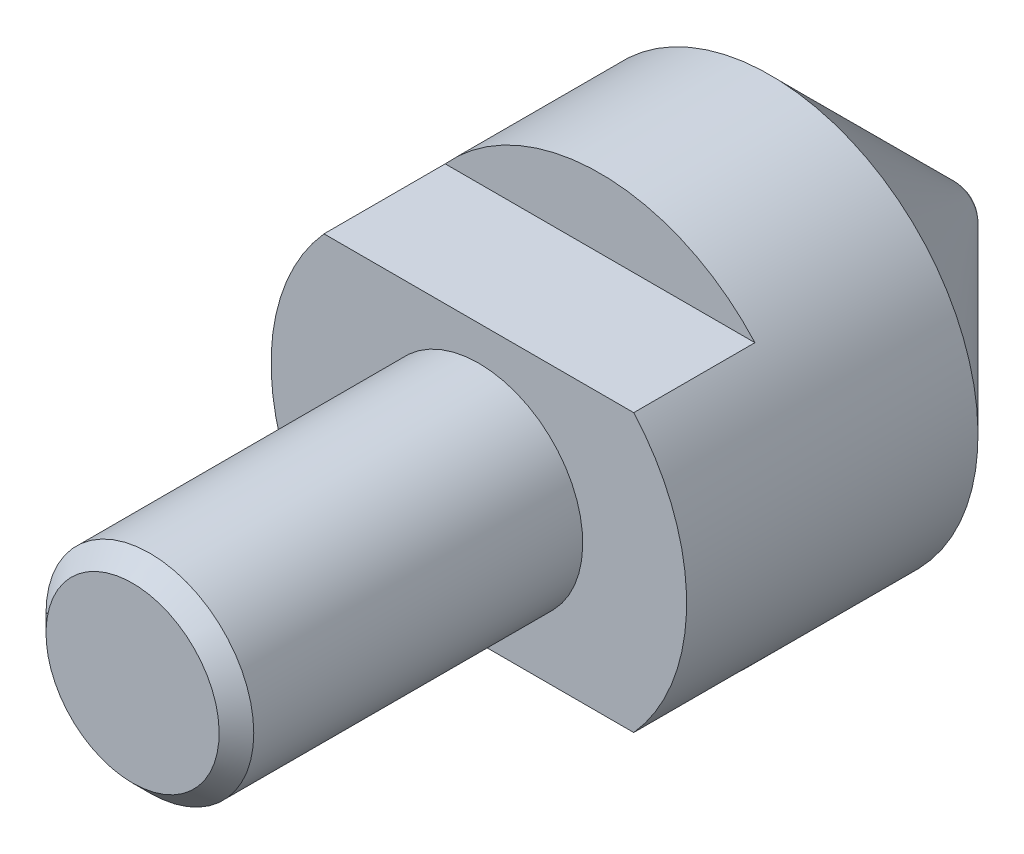
ISO-10303-21;
HEADER;
FILE_DESCRIPTION(('STEP AP214'),'2;1');
FILE_NAME('part.step','',(''),(''),'','','');
FILE_SCHEMA(('AUTOMOTIVE_DESIGN { 1 0 10303 214 1 1 1 1 }'));
ENDSEC;
DATA;
#1=APPLICATION_CONTEXT('core data for automotive mechanical design processes');
#2=APPLICATION_PROTOCOL_DEFINITION('international standard','automotive_design',2000,#1);
#3=PRODUCT_CONTEXT('',#1,'mechanical');
#4=PRODUCT('Part','Part','',(#3));
#5=PRODUCT_RELATED_PRODUCT_CATEGORY('part','',(#4));
#6=PRODUCT_DEFINITION_FORMATION('','',#4);
#7=PRODUCT_DEFINITION_CONTEXT('part definition',#1,'design');
#8=PRODUCT_DEFINITION('design','',#6,#7);
#9=PRODUCT_DEFINITION_SHAPE('','',#8);
#10=(LENGTH_UNIT() NAMED_UNIT(*) SI_UNIT(.MILLI.,.METRE.));
#11=(NAMED_UNIT(*) PLANE_ANGLE_UNIT() SI_UNIT($,.RADIAN.));
#12=(NAMED_UNIT(*) SI_UNIT($,.STERADIAN.) SOLID_ANGLE_UNIT());
#13=UNCERTAINTY_MEASURE_WITH_UNIT(LENGTH_MEASURE(1.E-05),#10,'distance_accuracy_value','');
#14=(GEOMETRIC_REPRESENTATION_CONTEXT(3) GLOBAL_UNCERTAINTY_ASSIGNED_CONTEXT((#13)) GLOBAL_UNIT_ASSIGNED_CONTEXT((#10,
#11,#12)) REPRESENTATION_CONTEXT('',''));
#15=CARTESIAN_POINT('',(0.,0.,0.));
#16=DIRECTION('',(0.,0.,1.));
#17=DIRECTION('',(1.,0.,0.));
#18=AXIS2_PLACEMENT_3D('',#15,#16,#17);
#19=CARTESIAN_POINT('',(2077.79922055998,636.139992065459,650.4382989673));
#20=DIRECTION('',(0.,-3.53531192938928E-11,-1.));
#21=DIRECTION('',(0.,1.,-3.53531192938928E-11));
#22=AXIS2_PLACEMENT_3D('',#19,#20,#21);
#23=CYLINDRICAL_SURFACE('',#22,5.99999999982481);
#24=DIRECTION('',(0.,3.53531192938928E-11,1.));
#25=VECTOR('',#24,1.);
#26=CARTESIAN_POINT('',(2082.27135519256,632.139990312449,646.938298599172));
#27=LINE('',#26,#25);
#28=CARTESIAN_POINT('',(2082.27135519256,632.139990312449,646.938298599172));
#29=VERTEX_POINT('',#28);
#30=CARTESIAN_POINT('',(2082.27135494691,632.139990312573,650.438298967441));
#31=VERTEX_POINT('',#30);
#32=EDGE_CURVE('E49',#29,#31,#27,.T.);
#33=ORIENTED_EDGE('',*,*,#32,.F.);
#34=CARTESIAN_POINT('',(2077.79921989241,636.139991044593,646.938298599031));
#35=DIRECTION('',(0.,3.53531192938928E-11,1.));
#36=DIRECTION('',(0.,1.,-3.53531192938928E-11));
#37=AXIS2_PLACEMENT_3D('',#34,#35,#36);
#38=CIRCLE('',#37,6.00000000000066);
#39=CARTESIAN_POINT('',(2073.32708459226,632.139990312449,646.938298599172));
#40=VERTEX_POINT('',#39);
#41=EDGE_CURVE('E82',#40,#29,#38,.T.);
#42=ORIENTED_EDGE('',*,*,#41,.F.);
#43=DIRECTION('',(0.,3.53531192938928E-11,1.));
#44=VECTOR('',#43,1.);
#45=CARTESIAN_POINT('',(2073.32708459226,632.139990312449,646.938298599172));
#46=LINE('',#45,#44);
#47=CARTESIAN_POINT('',(2073.32708459226,632.139990312573,650.438298967441));
#48=VERTEX_POINT('',#47);
#49=EDGE_CURVE('E77',#40,#48,#46,.T.);
#50=ORIENTED_EDGE('',*,*,#49,.T.);
#51=CARTESIAN_POINT('',(2077.79922055998,636.139992065459,650.4382989673));
#52=DIRECTION('',(0.,-3.53531192938928E-11,-1.));
#53=DIRECTION('',(0.,1.,-3.53531192938928E-11));
#54=AXIS2_PLACEMENT_3D('',#51,#52,#53);
#55=CIRCLE('',#54,5.99999999982481);
#56=CARTESIAN_POINT('',(2073.32708434708,640.13999177686,650.438298967159));
#57=VERTEX_POINT('',#56);
#58=EDGE_CURVE('E57',#48,#57,#55,.T.);
#59=ORIENTED_EDGE('',*,*,#58,.T.);
#60=DIRECTION('',(0.,3.53531192938928E-11,1.));
#61=VECTOR('',#60,1.);
#62=CARTESIAN_POINT('',(2073.32708459226,640.139991776736,646.93829859889));
#63=LINE('',#62,#61);
#64=CARTESIAN_POINT('',(2073.32708459226,640.139991776736,646.93829859889));
#65=VERTEX_POINT('',#64);
#66=EDGE_CURVE('E96',#65,#57,#63,.T.);
#67=ORIENTED_EDGE('',*,*,#66,.F.);
#68=CARTESIAN_POINT('',(2077.79921989241,636.139991044593,646.938298599031));
#69=DIRECTION('',(0.,3.53531192938928E-11,1.));
#70=DIRECTION('',(0.,-1.,3.53531192938928E-11));
#71=AXIS2_PLACEMENT_3D('',#68,#69,#70);
#72=CIRCLE('',#71,6.00000000000066);
#73=CARTESIAN_POINT('',(2082.27135519256,640.139991776736,646.93829859889));
#74=VERTEX_POINT('',#73);
#75=EDGE_CURVE('E219',#74,#65,#72,.T.);
#76=ORIENTED_EDGE('',*,*,#75,.F.);
#77=DIRECTION('',(0.,3.53531192938928E-11,1.));
#78=VECTOR('',#77,1.);
#79=CARTESIAN_POINT('',(2082.27135519256,640.139991776736,646.93829859889));
#80=LINE('',#79,#78);
#81=CARTESIAN_POINT('',(2082.27135519256,640.13999177686,650.438298967159));
#82=VERTEX_POINT('',#81);
#83=EDGE_CURVE('E92',#74,#82,#80,.T.);
#84=ORIENTED_EDGE('',*,*,#83,.T.);
#85=EDGE_CURVE('E91',#82,#31,#55,.T.);
#86=ORIENTED_EDGE('',*,*,#85,.T.);
#87=EDGE_LOOP('',(#33,#42,#50,#59,#67,#76,#84,#86));
#88=FACE_BOUND('',#87,.T.);
#89=CARTESIAN_POINT('',(2077.79922055998,636.139992065161,642.024085404752));
#90=DIRECTION('',(0.,-3.53531192938928E-11,-1.));
#91=DIRECTION('',(0.,1.,-3.53531192938928E-11));
#92=AXIS2_PLACEMENT_3D('',#89,#90,#91);
#93=CIRCLE('',#92,5.99999999982481);
#94=CARTESIAN_POINT('',(2077.79922055998,630.139992065336,642.024085404964));
#95=VERTEX_POINT('',#94);
#96=EDGE_CURVE('E105',#95,#95,#93,.T.);
#97=ORIENTED_EDGE('',*,*,#96,.F.);
#98=EDGE_LOOP('',(#97));
#99=FACE_BOUND('',#98,.T.);
#100=ADVANCED_FACE('F35',(#88,#99),#23,.T.);
#101=CARTESIAN_POINT('',(2077.79922055998,636.139992064974,636.731192186113));
#102=DIRECTION('',(0.,3.53531192938928E-11,1.));
#103=DIRECTION('',(0.,-1.,3.53531192938928E-11));
#104=AXIS2_PLACEMENT_3D('',#101,#102,#103);
#105=CONICAL_SURFACE('',#104,0.707106781186351,0.785398163397438);
#106=CARTESIAN_POINT('',(2077.79922055998,636.139992064974,636.731192186113));
#107=DIRECTION('',(0.,-3.53531192938928E-11,-1.));
#108=DIRECTION('',(0.,1.,-3.53531192938928E-11));
#109=AXIS2_PLACEMENT_3D('',#106,#107,#108);
#110=CIRCLE('',#109,0.707106781186351);
#111=CARTESIAN_POINT('',(2077.79922055998,635.432885283788,636.731192186138));
#112=VERTEX_POINT('',#111);
#113=EDGE_CURVE('E102',#112,#112,#110,.T.);
#114=CARTESIAN_POINT('',(2077.79922055998,630.139992065336,642.024085404964));
#115=CARTESIAN_POINT('',(2077.79922055998,630.195126369695,641.968951100601));
#116=CARTESIAN_POINT('',(2077.79922055998,630.250260674054,641.913816796239));
#117=CARTESIAN_POINT('',(2077.79922055998,630.360529282772,641.803548187513));
#118=CARTESIAN_POINT('',(2077.79922055998,630.415663587131,641.74841388315));
#119=CARTESIAN_POINT('',(2077.79922055998,630.525932195849,641.638145274425));
#120=CARTESIAN_POINT('',(2077.79922055998,630.581066500207,641.583010970062));
#121=CARTESIAN_POINT('',(2077.79922055998,630.691335108925,641.472742361336));
#122=CARTESIAN_POINT('',(2077.79922055998,630.746469413284,641.417608056974));
#123=CARTESIAN_POINT('',(2077.79922055998,630.856738022002,641.307339448248));
#124=CARTESIAN_POINT('',(2077.79922055998,630.911872326361,641.252205143885));
#125=CARTESIAN_POINT('',(2077.79922055998,631.022140935078,641.14193653516));
#126=CARTESIAN_POINT('',(2077.79922055998,631.077275239437,641.086802230797));
#127=CARTESIAN_POINT('',(2077.79922055998,631.187543848155,640.976533622072));
#128=CARTESIAN_POINT('',(2077.79922055998,631.242678152514,640.921399317709));
#129=CARTESIAN_POINT('',(2077.79922055998,631.352946761232,640.811130708983));
#130=CARTESIAN_POINT('',(2077.79922055998,631.40808106559,640.75599640462));
#131=CARTESIAN_POINT('',(2077.79922055998,631.518349674308,640.645727795895));
#132=CARTESIAN_POINT('',(2077.79922055998,631.573483978667,640.590593491532));
#133=CARTESIAN_POINT('',(2077.79922055998,631.683752587385,640.480324882807));
#134=CARTESIAN_POINT('',(2077.79922055998,631.738886891744,640.425190578444));
#135=CARTESIAN_POINT('',(2077.79922055998,631.849155500462,640.314921969718));
#136=CARTESIAN_POINT('',(2077.79922055998,631.90428980482,640.259787665355));
#137=CARTESIAN_POINT('',(2077.79922055998,632.014558413538,640.14951905663));
#138=CARTESIAN_POINT('',(2077.79922055998,632.069692717897,640.094384752267));
#139=CARTESIAN_POINT('',(2077.79922055998,632.179961326615,639.984116143542));
#140=CARTESIAN_POINT('',(2077.79922055998,632.235095630973,639.928981839179));
#141=CARTESIAN_POINT('',(2077.79922055998,632.345364239691,639.818713230453));
#142=CARTESIAN_POINT('',(2077.79922055998,632.40049854405,639.763578926091));
#143=CARTESIAN_POINT('',(2077.79922055998,632.510767152768,639.653310317365));
#144=CARTESIAN_POINT('',(2077.79922055998,632.565901457127,639.598176013002));
#145=CARTESIAN_POINT('',(2077.79922055998,632.676170065844,639.487907404277));
#146=CARTESIAN_POINT('',(2077.79922055998,632.731304370203,639.432773099914));
#147=CARTESIAN_POINT('',(2077.79922055998,632.841572978921,639.322504491188));
#148=CARTESIAN_POINT('',(2077.79922055998,632.89670728328,639.267370186826));
#149=CARTESIAN_POINT('',(2077.79922055998,633.006975891998,639.1571015781));
#150=CARTESIAN_POINT('',(2077.79922055998,633.062110196356,639.101967273737));
#151=CARTESIAN_POINT('',(2077.79922055998,633.172378805074,638.991698665012));
#152=CARTESIAN_POINT('',(2077.79922055998,633.227513109433,638.936564360649));
#153=CARTESIAN_POINT('',(2077.79922055998,633.337781718151,638.826295751924));
#154=CARTESIAN_POINT('',(2077.79922055998,633.39291602251,638.771161447561));
#155=CARTESIAN_POINT('',(2077.79922055998,633.503184631227,638.660892838835));
#156=CARTESIAN_POINT('',(2077.79922055998,633.558318935586,638.605758534473));
#157=CARTESIAN_POINT('',(2077.79922055998,633.668587544304,638.495489925747));
#158=CARTESIAN_POINT('',(2077.79922055998,633.723721848663,638.440355621384));
#159=CARTESIAN_POINT('',(2077.79922055998,633.833990457381,638.330087012659));
#160=CARTESIAN_POINT('',(2077.79922055998,633.889124761739,638.274952708296));
#161=CARTESIAN_POINT('',(2077.79922055998,633.999393370457,638.16468409957));
#162=CARTESIAN_POINT('',(2077.79922055998,634.054527674816,638.109549795208));
#163=CARTESIAN_POINT('',(2077.79922055998,634.164796283534,637.999281186482));
#164=CARTESIAN_POINT('',(2077.79922055998,634.219930587893,637.944146882119));
#165=CARTESIAN_POINT('',(2077.79922055998,634.33019919661,637.833878273394));
#166=CARTESIAN_POINT('',(2077.79922055998,634.385333500969,637.778743969031));
#167=CARTESIAN_POINT('',(2077.79922055998,634.495602109687,637.668475360305));
#168=CARTESIAN_POINT('',(2077.79922055998,634.550736414046,637.613341055943));
#169=CARTESIAN_POINT('',(2077.79922055998,634.661005022764,637.503072447217));
#170=CARTESIAN_POINT('',(2077.79922055998,634.716139327123,637.447938142854));
#171=CARTESIAN_POINT('',(2077.79922055998,634.82640793584,637.337669534129));
#172=CARTESIAN_POINT('',(2077.79922055998,634.881542240199,637.282535229766));
#173=CARTESIAN_POINT('',(2077.79922055998,634.991810848917,637.172266621041));
#174=CARTESIAN_POINT('',(2077.79922055998,635.046945153276,637.117132316678));
#175=CARTESIAN_POINT('',(2077.79922055998,635.157213761993,637.006863707952));
#176=CARTESIAN_POINT('',(2077.79922055998,635.212348066352,636.95172940359));
#177=CARTESIAN_POINT('',(2077.79922055998,635.32261667507,636.841460794864));
#178=CARTESIAN_POINT('',(2077.79922055998,635.377750979429,636.786326490501));
#179=CARTESIAN_POINT('',(2077.79922055998,635.432885283788,636.731192186139));
#180=B_SPLINE_CURVE_WITH_KNOTS('',3,(#114,#115,#116,#117,#118,#119,#120,#121,#122,#123,#124,
#125,#126,#127,#128,#129,#130,#131,#132,#133,#134,#135,#136,#137,#138,#139,#140,#141,#142,#143,
#144,#145,#146,#147,#148,#149,#150,#151,#152,#153,#154,#155,#156,#157,#158,#159,#160,#161,#162,
#163,#164,#165,#166,#167,#168,#169,#170,#171,#172,#173,#174,#175,#176,#177,#178,#179),
.UNSPECIFIED.,.F.,.F.,(4,2,2,2,2,2,2,2,2,2,2,2,2,2,2,2,2,2,2,2,2,2,2,2,2,2,2,2,2,2,2,2,4),(0.,
0.233915042937418,0.467830085874601,0.701745128811704,0.935660171748965,1.1695752146863,
1.40349025762341,1.63740530056067,1.87132034349785,2.10523538643504,2.33915042937237,
2.57306547230956,2.80698051524674,3.040895558184,3.27481060112126,3.50872564405836,
3.7426406869957,3.97655572993289,4.21047077286999,4.44438581580733,4.67830085874459,
4.91221590168169,5.14613094461896,5.38004598755622,5.61396103049332,5.84787607343066,
6.08179111636784,6.31570615930495,6.54962120224229,6.78353624517955,7.01745128811665,
7.25136633105391,7.48528137399117),.UNSPECIFIED.);
#181=EDGE_CURVE('BSEAM125',#95,#112,#180,.T.);
#182=ORIENTED_EDGE('',*,*,#96,.T.);
#183=ORIENTED_EDGE('',*,*,#113,.F.);
#184=ORIENTED_EDGE('',*,*,#181,.T.);
#185=ORIENTED_EDGE('',*,*,#181,.F.);
#186=EDGE_LOOP('',(#182,#184,#183,#185));
#187=FACE_BOUND('',#186,.T.);
#188=ADVANCED_FACE('F125',(#187),#105,.T.);
#189=CARTESIAN_POINT('',(2077.79922055998,636.139992064999,637.4382989673));
#190=DIRECTION('',(0.,-3.53531192938928E-11,-1.));
#191=DIRECTION('',(-1.,0.,0.));
#192=AXIS2_PLACEMENT_3D('',#189,#190,#191);
#193=SPHERICAL_SURFACE('',#192,0.999999999999901);
#194=ORIENTED_EDGE('',*,*,#113,.T.);
#195=EDGE_LOOP('',(#194));
#196=FACE_BOUND('',#195,.T.);
#197=ADVANCED_FACE('F129',(#196),#193,.T.);
#198=CARTESIAN_POINT('',(2080.79922055998,636.139992065812,660.4382989673));
#199=DIRECTION('',(0.,3.53531192938928E-11,1.));
#200=DIRECTION('',(0.,-1.,3.53531192938928E-11));
#201=AXIS2_PLACEMENT_3D('',#198,#199,#200);
#202=PLANE('',#201);
#203=CARTESIAN_POINT('',(2077.79922055998,636.139992065812,660.4382989673));
#204=DIRECTION('',(0.,3.53531192938928E-11,1.));
#205=DIRECTION('',(0.,-1.,3.53531192938928E-11));
#206=AXIS2_PLACEMENT_3D('',#203,#204,#205);
#207=CIRCLE('',#206,2.50000000000028);
#208=CARTESIAN_POINT('',(2077.79922055998,633.639992065812,660.438298967388));
#209=VERTEX_POINT('',#208);
#210=EDGE_CURVE('E11',#209,#209,#207,.T.);
#211=ORIENTED_EDGE('',*,*,#210,.T.);
#212=EDGE_LOOP('',(#211));
#213=FACE_BOUND('',#212,.T.);
#214=ADVANCED_FACE('F134',(#213),#202,.T.);
#215=CARTESIAN_POINT('',(2077.79922055998,636.139992065459,650.4382989673));
#216=DIRECTION('',(0.,-3.53531192938928E-11,-1.));
#217=DIRECTION('',(0.,1.,-3.53531192938928E-11));
#218=AXIS2_PLACEMENT_3D('',#215,#216,#217);
#219=CYLINDRICAL_SURFACE('',#218,3.00000000000011);
#220=CARTESIAN_POINT('',(2077.79922055998,636.139992065795,659.9382989673));
#221=DIRECTION('',(0.,3.53050921830839E-11,1.));
#222=DIRECTION('',(0.,-1.,3.53050921830839E-11));
#223=AXIS2_PLACEMENT_3D('',#220,#221,#222);
#224=CIRCLE('',#223,3.00000000000011);
#225=CARTESIAN_POINT('',(2077.79922055998,633.139992065795,659.938298967406));
#226=VERTEX_POINT('',#225);
#227=EDGE_CURVE('E42',#226,#226,#224,.F.);
#228=ORIENTED_EDGE('',*,*,#227,.T.);
#229=EDGE_LOOP('',(#228));
#230=FACE_BOUND('',#229,.T.);
#231=CARTESIAN_POINT('',(2077.79922055998,636.139992065459,650.4382989673));
#232=DIRECTION('',(0.,-3.53531192938928E-11,-1.));
#233=DIRECTION('',(0.,1.,-3.53531192938928E-11));
#234=AXIS2_PLACEMENT_3D('',#231,#232,#233);
#235=CIRCLE('',#234,3.00000000000011);
#236=CARTESIAN_POINT('',(2077.79922055998,639.139992065459,650.438298967194));
#237=VERTEX_POINT('',#236);
#238=EDGE_CURVE('E94',#237,#237,#235,.T.);
#239=ORIENTED_EDGE('',*,*,#238,.F.);
#240=EDGE_LOOP('',(#239));
#241=FACE_BOUND('',#240,.T.);
#242=ADVANCED_FACE('F110',(#230,#241),#219,.T.);
#243=CARTESIAN_POINT('',(2083.7992205598,636.139992065459,650.4382989673));
#244=DIRECTION('',(0.,3.53531192938928E-11,1.));
#245=DIRECTION('',(0.,-1.,3.53531192938928E-11));
#246=AXIS2_PLACEMENT_3D('',#243,#244,#245);
#247=PLANE('',#246);
#248=DIRECTION('',(-1.,0.,0.));
#249=VECTOR('',#248,1.);
#250=CARTESIAN_POINT('',(2073.32708459226,632.139990312573,650.438298967441));
#251=LINE('',#250,#249);
#252=EDGE_CURVE('E75',#31,#48,#251,.T.);
#253=ORIENTED_EDGE('',*,*,#252,.F.);
#254=ORIENTED_EDGE('',*,*,#85,.F.);
#255=DIRECTION('',(1.,0.,0.));
#256=VECTOR('',#255,1.);
#257=CARTESIAN_POINT('',(2073.32708459226,640.13999177686,650.438298967159));
#258=LINE('',#257,#256);
#259=EDGE_CURVE('E86',#57,#82,#258,.T.);
#260=ORIENTED_EDGE('',*,*,#259,.F.);
#261=ORIENTED_EDGE('',*,*,#58,.F.);
#262=EDGE_LOOP('',(#253,#254,#260,#261));
#263=FACE_BOUND('',#262,.T.);
#264=ORIENTED_EDGE('',*,*,#238,.T.);
#265=EDGE_LOOP('',(#264));
#266=FACE_BOUND('',#265,.T.);
#267=ADVANCED_FACE('F89',(#263,#266),#247,.T.);
#268=CARTESIAN_POINT('',(2073.32708459226,640.139991776736,646.93829859889));
#269=DIRECTION('',(0.,-1.,3.53531192938928E-11));
#270=DIRECTION('',(0.,-3.53531192938928E-11,-1.));
#271=AXIS2_PLACEMENT_3D('',#268,#269,#270);
#272=PLANE('',#271);
#273=ORIENTED_EDGE('',*,*,#259,.T.);
#274=ORIENTED_EDGE('',*,*,#83,.F.);
#275=DIRECTION('',(1.,0.,0.));
#276=VECTOR('',#275,1.);
#277=CARTESIAN_POINT('',(2073.32708459226,640.139991776736,646.93829859889));
#278=LINE('',#277,#276);
#279=EDGE_CURVE('E221',#65,#74,#278,.T.);
#280=ORIENTED_EDGE('',*,*,#279,.F.);
#281=ORIENTED_EDGE('',*,*,#66,.T.);
#282=EDGE_LOOP('',(#273,#274,#280,#281));
#283=FACE_BOUND('',#282,.T.);
#284=ADVANCED_FACE('F146',(#283),#272,.F.);
#285=CARTESIAN_POINT('',(2077.79921989241,636.139991044593,646.938298599031));
#286=DIRECTION('',(0.,3.53531192938928E-11,1.));
#287=DIRECTION('',(0.,-1.,3.53531192938928E-11));
#288=AXIS2_PLACEMENT_3D('',#285,#286,#287);
#289=PLANE('',#288);
#290=ORIENTED_EDGE('',*,*,#75,.T.);
#291=ORIENTED_EDGE('',*,*,#279,.T.);
#292=EDGE_LOOP('',(#290,#291));
#293=FACE_BOUND('',#292,.T.);
#294=ADVANCED_FACE('F149',(#293),#289,.T.);
#295=CARTESIAN_POINT('',(2073.32708459226,632.139990312449,646.938298599172));
#296=DIRECTION('',(0.,1.,-3.53531192938928E-11));
#297=DIRECTION('',(0.,3.53531192938928E-11,1.));
#298=AXIS2_PLACEMENT_3D('',#295,#296,#297);
#299=PLANE('',#298);
#300=ORIENTED_EDGE('',*,*,#252,.T.);
#301=ORIENTED_EDGE('',*,*,#49,.F.);
#302=DIRECTION('',(-1.,0.,0.));
#303=VECTOR('',#302,1.);
#304=CARTESIAN_POINT('',(2073.32708459226,632.139990312449,646.938298599172));
#305=LINE('',#304,#303);
#306=EDGE_CURVE('E226',#29,#40,#305,.T.);
#307=ORIENTED_EDGE('',*,*,#306,.F.);
#308=ORIENTED_EDGE('',*,*,#32,.T.);
#309=EDGE_LOOP('',(#300,#301,#307,#308));
#310=FACE_BOUND('',#309,.T.);
#311=ADVANCED_FACE('F76',(#310),#299,.F.);
#312=CARTESIAN_POINT('',(2077.79921989241,636.139991044593,646.938298599031));
#313=DIRECTION('',(0.,-3.53531192938928E-11,-1.));
#314=DIRECTION('',(0.,1.,-3.53531192938928E-11));
#315=AXIS2_PLACEMENT_3D('',#312,#313,#314);
#316=PLANE('',#315);
#317=ORIENTED_EDGE('',*,*,#41,.T.);
#318=ORIENTED_EDGE('',*,*,#306,.T.);
#319=EDGE_LOOP('',(#317,#318));
#320=FACE_BOUND('',#319,.T.);
#321=ADVANCED_FACE('F115',(#320),#316,.F.);
#322=CARTESIAN_POINT('',(2077.79922055998,636.139992065795,659.9382989673));
#323=DIRECTION('',(0.,-3.53050921830839E-11,-1.));
#324=DIRECTION('',(0.,1.,-3.53050921830839E-11));
#325=AXIS2_PLACEMENT_3D('',#322,#323,#324);
#326=CONICAL_SURFACE('',#325,3.00000000000011,0.785398163397412);
#327=ORIENTED_EDGE('',*,*,#210,.F.);
#328=EDGE_LOOP('',(#327));
#329=FACE_BOUND('',#328,.T.);
#330=ORIENTED_EDGE('',*,*,#227,.F.);
#331=EDGE_LOOP('',(#330));
#332=FACE_BOUND('',#331,.T.);
#333=ADVANCED_FACE('F113',(#329,#332),#326,.T.);
#334=CLOSED_SHELL('',(#100,#188,#197,#214,#242,#267,#284,#294,#311,#321,#333));
#335=MANIFOLD_SOLID_BREP('B2',#334);
#336=ADVANCED_BREP_SHAPE_REPRESENTATION('',(#18,#335),#14);
#337=SHAPE_DEFINITION_REPRESENTATION(#9,#336);
ENDSEC;
END-ISO-10303-21;
